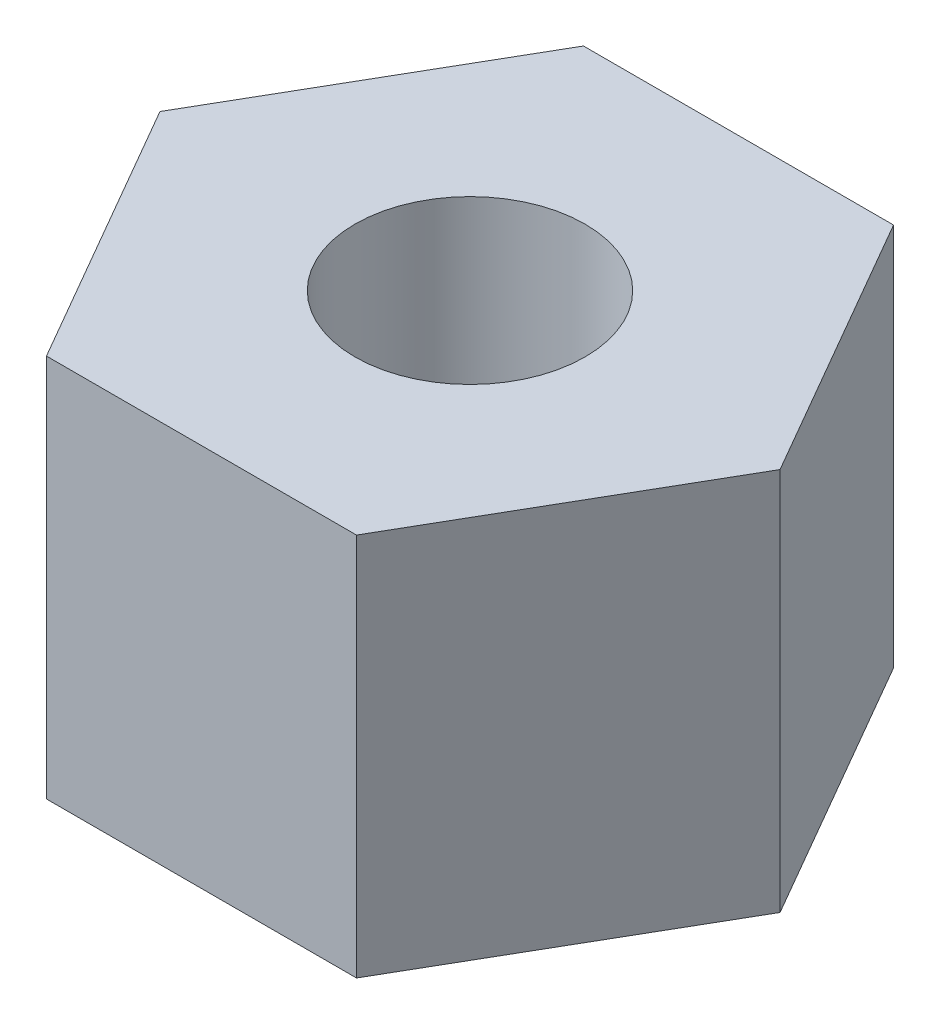
ISO-10303-21;
HEADER;
FILE_DESCRIPTION(('STEP AP214'),'2;1');
FILE_NAME('part.step','',(''),(''),'','','');
FILE_SCHEMA(('AUTOMOTIVE_DESIGN { 1 0 10303 214 1 1 1 1 }'));
ENDSEC;
DATA;
#1=APPLICATION_CONTEXT('core data for automotive mechanical design processes');
#2=APPLICATION_PROTOCOL_DEFINITION('international standard','automotive_design',2000,#1);
#3=PRODUCT_CONTEXT('',#1,'mechanical');
#4=PRODUCT('Part','Part','',(#3));
#5=PRODUCT_RELATED_PRODUCT_CATEGORY('part','',(#4));
#6=PRODUCT_DEFINITION_FORMATION('','',#4);
#7=PRODUCT_DEFINITION_CONTEXT('part definition',#1,'design');
#8=PRODUCT_DEFINITION('design','',#6,#7);
#9=PRODUCT_DEFINITION_SHAPE('','',#8);
#10=(LENGTH_UNIT() NAMED_UNIT(*) SI_UNIT(.MILLI.,.METRE.));
#11=(NAMED_UNIT(*) PLANE_ANGLE_UNIT() SI_UNIT($,.RADIAN.));
#12=(NAMED_UNIT(*) SI_UNIT($,.STERADIAN.) SOLID_ANGLE_UNIT());
#13=UNCERTAINTY_MEASURE_WITH_UNIT(LENGTH_MEASURE(1.E-05),#10,'distance_accuracy_value','');
#14=(GEOMETRIC_REPRESENTATION_CONTEXT(3) GLOBAL_UNCERTAINTY_ASSIGNED_CONTEXT((#13)) GLOBAL_UNIT_ASSIGNED_CONTEXT((#10,
#11,#12)) REPRESENTATION_CONTEXT('',''));
#15=CARTESIAN_POINT('',(0.,0.,0.));
#16=DIRECTION('',(0.,0.,1.));
#17=DIRECTION('',(1.,0.,0.));
#18=AXIS2_PLACEMENT_3D('',#15,#16,#17);
#19=CARTESIAN_POINT('',(0.,2.5,3.5));
#20=DIRECTION('',(0.,0.,-1.));
#21=DIRECTION('',(-1.,0.,0.));
#22=AXIS2_PLACEMENT_3D('',#19,#20,#21);
#23=PLANE('',#22);
#24=DIRECTION('',(1.,0.,0.));
#25=VECTOR('',#24,1.);
#26=CARTESIAN_POINT('',(0.,-2.5,3.5));
#27=LINE('',#26,#25);
#28=CARTESIAN_POINT('',(-2.02072594216369,-2.5,3.5));
#29=VERTEX_POINT('',#28);
#30=CARTESIAN_POINT('',(2.02072594216369,-2.5,3.5));
#31=VERTEX_POINT('',#30);
#32=EDGE_CURVE('E123',#29,#31,#27,.T.);
#33=ORIENTED_EDGE('',*,*,#32,.T.);
#34=DIRECTION('',(0.,-1.,0.));
#35=VECTOR('',#34,1.);
#36=CARTESIAN_POINT('',(2.02072594216369,2.5,3.5));
#37=LINE('',#36,#35);
#38=CARTESIAN_POINT('',(2.02072594216369,2.5,3.5));
#39=VERTEX_POINT('',#38);
#40=EDGE_CURVE('E11',#39,#31,#37,.T.);
#41=ORIENTED_EDGE('',*,*,#40,.F.);
#42=DIRECTION('',(1.,0.,0.));
#43=VECTOR('',#42,1.);
#44=CARTESIAN_POINT('',(0.,2.5,3.5));
#45=LINE('',#44,#43);
#46=CARTESIAN_POINT('',(-2.02072594216369,2.5,3.5));
#47=VERTEX_POINT('',#46);
#48=EDGE_CURVE('E146',#47,#39,#45,.T.);
#49=ORIENTED_EDGE('',*,*,#48,.F.);
#50=DIRECTION('',(0.,-1.,0.));
#51=VECTOR('',#50,1.);
#52=CARTESIAN_POINT('',(-2.02072594216369,2.5,3.5));
#53=LINE('',#52,#51);
#54=EDGE_CURVE('E116',#47,#29,#53,.T.);
#55=ORIENTED_EDGE('',*,*,#54,.T.);
#56=EDGE_LOOP('',(#33,#41,#49,#55));
#57=FACE_BOUND('',#56,.T.);
#58=ADVANCED_FACE('F35',(#57),#23,.F.);
#59=CARTESIAN_POINT('',(3.03108891324554,2.5,1.75));
#60=DIRECTION('',(-0.866025403784439,0.,-0.5));
#61=DIRECTION('',(-0.5,0.,0.866025403784439));
#62=AXIS2_PLACEMENT_3D('',#59,#60,#61);
#63=PLANE('',#62);
#64=DIRECTION('',(0.5,0.,-0.866025403784439));
#65=VECTOR('',#64,1.);
#66=CARTESIAN_POINT('',(3.03108891324554,-2.5,1.75));
#67=LINE('',#66,#65);
#68=CARTESIAN_POINT('',(4.04145188432738,-2.5,0.));
#69=VERTEX_POINT('',#68);
#70=EDGE_CURVE('E126',#31,#69,#67,.T.);
#71=ORIENTED_EDGE('',*,*,#70,.T.);
#72=DIRECTION('',(0.,-1.,0.));
#73=VECTOR('',#72,1.);
#74=CARTESIAN_POINT('',(4.04145188432738,2.5,0.));
#75=LINE('',#74,#73);
#76=CARTESIAN_POINT('',(4.04145188432738,2.5,0.));
#77=VERTEX_POINT('',#76);
#78=EDGE_CURVE('E44',#77,#69,#75,.T.);
#79=ORIENTED_EDGE('',*,*,#78,.F.);
#80=DIRECTION('',(0.5,0.,-0.866025403784439));
#81=VECTOR('',#80,1.);
#82=CARTESIAN_POINT('',(3.03108891324554,2.5,1.75));
#83=LINE('',#82,#81);
#84=EDGE_CURVE('E89',#39,#77,#83,.T.);
#85=ORIENTED_EDGE('',*,*,#84,.F.);
#86=ORIENTED_EDGE('',*,*,#40,.T.);
#87=EDGE_LOOP('',(#71,#79,#85,#86));
#88=FACE_BOUND('',#87,.T.);
#89=ADVANCED_FACE('F160',(#88),#63,.F.);
#90=CARTESIAN_POINT('',(3.03108891324554,2.5,-1.75));
#91=DIRECTION('',(-0.866025403784439,0.,0.5));
#92=DIRECTION('',(0.5,0.,0.866025403784439));
#93=AXIS2_PLACEMENT_3D('',#90,#91,#92);
#94=PLANE('',#93);
#95=DIRECTION('',(-0.5,0.,-0.866025403784439));
#96=VECTOR('',#95,1.);
#97=CARTESIAN_POINT('',(3.03108891324554,-2.5,-1.75));
#98=LINE('',#97,#96);
#99=CARTESIAN_POINT('',(2.02072594216369,-2.5,-3.5));
#100=VERTEX_POINT('',#99);
#101=EDGE_CURVE('E128',#69,#100,#98,.T.);
#102=ORIENTED_EDGE('',*,*,#101,.T.);
#103=DIRECTION('',(0.,-1.,0.));
#104=VECTOR('',#103,1.);
#105=CARTESIAN_POINT('',(2.02072594216369,2.5,-3.5));
#106=LINE('',#105,#104);
#107=CARTESIAN_POINT('',(2.02072594216369,2.5,-3.5));
#108=VERTEX_POINT('',#107);
#109=EDGE_CURVE('E111',#108,#100,#106,.T.);
#110=ORIENTED_EDGE('',*,*,#109,.F.);
#111=DIRECTION('',(-0.5,0.,-0.866025403784439));
#112=VECTOR('',#111,1.);
#113=CARTESIAN_POINT('',(3.03108891324554,2.5,-1.75));
#114=LINE('',#113,#112);
#115=EDGE_CURVE('E102',#77,#108,#114,.T.);
#116=ORIENTED_EDGE('',*,*,#115,.F.);
#117=ORIENTED_EDGE('',*,*,#78,.T.);
#118=EDGE_LOOP('',(#102,#110,#116,#117));
#119=FACE_BOUND('',#118,.T.);
#120=ADVANCED_FACE('F139',(#119),#94,.F.);
#121=CARTESIAN_POINT('',(0.,2.5,-3.5));
#122=DIRECTION('',(0.,0.,1.));
#123=DIRECTION('',(1.,0.,0.));
#124=AXIS2_PLACEMENT_3D('',#121,#122,#123);
#125=PLANE('',#124);
#126=DIRECTION('',(-1.,0.,0.));
#127=VECTOR('',#126,1.);
#128=CARTESIAN_POINT('',(0.,-2.5,-3.5));
#129=LINE('',#128,#127);
#130=CARTESIAN_POINT('',(-2.02072594216369,-2.5,-3.5));
#131=VERTEX_POINT('',#130);
#132=EDGE_CURVE('E110',#100,#131,#129,.T.);
#133=ORIENTED_EDGE('',*,*,#132,.T.);
#134=DIRECTION('',(0.,-1.,0.));
#135=VECTOR('',#134,1.);
#136=CARTESIAN_POINT('',(-2.02072594216369,2.5,-3.5));
#137=LINE('',#136,#135);
#138=CARTESIAN_POINT('',(-2.02072594216369,2.5,-3.5));
#139=VERTEX_POINT('',#138);
#140=EDGE_CURVE('E107',#139,#131,#137,.T.);
#141=ORIENTED_EDGE('',*,*,#140,.F.);
#142=DIRECTION('',(-1.,0.,0.));
#143=VECTOR('',#142,1.);
#144=CARTESIAN_POINT('',(0.,2.5,-3.5));
#145=LINE('',#144,#143);
#146=EDGE_CURVE('E96',#108,#139,#145,.T.);
#147=ORIENTED_EDGE('',*,*,#146,.F.);
#148=ORIENTED_EDGE('',*,*,#109,.T.);
#149=EDGE_LOOP('',(#133,#141,#147,#148));
#150=FACE_BOUND('',#149,.T.);
#151=ADVANCED_FACE('F108',(#150),#125,.F.);
#152=CARTESIAN_POINT('',(-3.03108891324554,2.5,-1.75));
#153=DIRECTION('',(0.866025403784439,0.,0.5));
#154=DIRECTION('',(0.5,0.,-0.866025403784439));
#155=AXIS2_PLACEMENT_3D('',#152,#153,#154);
#156=PLANE('',#155);
#157=DIRECTION('',(-0.5,0.,0.866025403784439));
#158=VECTOR('',#157,1.);
#159=CARTESIAN_POINT('',(-3.03108891324554,-2.5,-1.75));
#160=LINE('',#159,#158);
#161=CARTESIAN_POINT('',(-4.04145188432738,-2.5,0.));
#162=VERTEX_POINT('',#161);
#163=EDGE_CURVE('E75',#131,#162,#160,.T.);
#164=ORIENTED_EDGE('',*,*,#163,.T.);
#165=DIRECTION('',(0.,-1.,0.));
#166=VECTOR('',#165,1.);
#167=CARTESIAN_POINT('',(-4.04145188432738,2.5,0.));
#168=LINE('',#167,#166);
#169=CARTESIAN_POINT('',(-4.04145188432738,2.5,0.));
#170=VERTEX_POINT('',#169);
#171=EDGE_CURVE('E112',#170,#162,#168,.T.);
#172=ORIENTED_EDGE('',*,*,#171,.F.);
#173=DIRECTION('',(-0.5,0.,0.866025403784439));
#174=VECTOR('',#173,1.);
#175=CARTESIAN_POINT('',(-3.03108891324554,2.5,-1.75));
#176=LINE('',#175,#174);
#177=EDGE_CURVE('E100',#139,#170,#176,.T.);
#178=ORIENTED_EDGE('',*,*,#177,.F.);
#179=ORIENTED_EDGE('',*,*,#140,.T.);
#180=EDGE_LOOP('',(#164,#172,#178,#179));
#181=FACE_BOUND('',#180,.T.);
#182=ADVANCED_FACE('F114',(#181),#156,.F.);
#183=CARTESIAN_POINT('',(0.,2.5,0.));
#184=DIRECTION('',(0.,-1.,0.));
#185=DIRECTION('',(0.,0.,-1.));
#186=AXIS2_PLACEMENT_3D('',#183,#184,#185);
#187=CYLINDRICAL_SURFACE('',#186,1.5);
#188=CARTESIAN_POINT('',(0.,2.5,0.));
#189=DIRECTION('',(0.,1.,0.));
#190=DIRECTION('',(0.,0.,1.));
#191=AXIS2_PLACEMENT_3D('',#188,#189,#190);
#192=CIRCLE('',#191,1.5);
#193=CARTESIAN_POINT('',(0.,2.5,1.5));
#194=VERTEX_POINT('',#193);
#195=EDGE_CURVE('E133',#194,#194,#192,.T.);
#196=ORIENTED_EDGE('',*,*,#195,.T.);
#197=EDGE_LOOP('',(#196));
#198=FACE_BOUND('',#197,.T.);
#199=CARTESIAN_POINT('',(0.,-2.5,0.));
#200=DIRECTION('',(0.,1.,0.));
#201=DIRECTION('',(0.,0.,1.));
#202=AXIS2_PLACEMENT_3D('',#199,#200,#201);
#203=CIRCLE('',#202,1.5);
#204=CARTESIAN_POINT('',(0.,-2.5,1.5));
#205=VERTEX_POINT('',#204);
#206=EDGE_CURVE('E120',#205,#205,#203,.T.);
#207=ORIENTED_EDGE('',*,*,#206,.F.);
#208=EDGE_LOOP('',(#207));
#209=FACE_BOUND('',#208,.T.);
#210=ADVANCED_FACE('F37',(#198,#209),#187,.F.);
#211=CARTESIAN_POINT('',(-3.03108891324554,2.5,1.75));
#212=DIRECTION('',(0.866025403784439,0.,-0.5));
#213=DIRECTION('',(-0.5,0.,-0.866025403784439));
#214=AXIS2_PLACEMENT_3D('',#211,#212,#213);
#215=PLANE('',#214);
#216=DIRECTION('',(0.5,0.,0.866025403784439));
#217=VECTOR('',#216,1.);
#218=CARTESIAN_POINT('',(-3.03108891324554,-2.5,1.75));
#219=LINE('',#218,#217);
#220=EDGE_CURVE('E81',#162,#29,#219,.T.);
#221=ORIENTED_EDGE('',*,*,#220,.T.);
#222=ORIENTED_EDGE('',*,*,#54,.F.);
#223=DIRECTION('',(0.5,0.,0.866025403784439));
#224=VECTOR('',#223,1.);
#225=CARTESIAN_POINT('',(-3.03108891324554,2.5,1.75));
#226=LINE('',#225,#224);
#227=EDGE_CURVE('E52',#170,#47,#226,.T.);
#228=ORIENTED_EDGE('',*,*,#227,.F.);
#229=ORIENTED_EDGE('',*,*,#171,.T.);
#230=EDGE_LOOP('',(#221,#222,#228,#229));
#231=FACE_BOUND('',#230,.T.);
#232=ADVANCED_FACE('F147',(#231),#215,.F.);
#233=CARTESIAN_POINT('',(0.,2.5,0.));
#234=DIRECTION('',(0.,1.,0.));
#235=DIRECTION('',(0.,0.,1.));
#236=AXIS2_PLACEMENT_3D('',#233,#234,#235);
#237=PLANE('',#236);
#238=ORIENTED_EDGE('',*,*,#195,.F.);
#239=EDGE_LOOP('',(#238));
#240=FACE_BOUND('',#239,.T.);
#241=ORIENTED_EDGE('',*,*,#48,.T.);
#242=ORIENTED_EDGE('',*,*,#84,.T.);
#243=ORIENTED_EDGE('',*,*,#115,.T.);
#244=ORIENTED_EDGE('',*,*,#146,.T.);
#245=ORIENTED_EDGE('',*,*,#177,.T.);
#246=ORIENTED_EDGE('',*,*,#227,.T.);
#247=EDGE_LOOP('',(#241,#242,#243,#244,#245,#246));
#248=FACE_BOUND('',#247,.T.);
#249=ADVANCED_FACE('F98',(#240,#248),#237,.T.);
#250=CARTESIAN_POINT('',(0.,-2.5,0.));
#251=DIRECTION('',(0.,1.,0.));
#252=DIRECTION('',(0.,0.,1.));
#253=AXIS2_PLACEMENT_3D('',#250,#251,#252);
#254=PLANE('',#253);
#255=ORIENTED_EDGE('',*,*,#206,.T.);
#256=EDGE_LOOP('',(#255));
#257=FACE_BOUND('',#256,.T.);
#258=ORIENTED_EDGE('',*,*,#32,.F.);
#259=ORIENTED_EDGE('',*,*,#220,.F.);
#260=ORIENTED_EDGE('',*,*,#163,.F.);
#261=ORIENTED_EDGE('',*,*,#132,.F.);
#262=ORIENTED_EDGE('',*,*,#101,.F.);
#263=ORIENTED_EDGE('',*,*,#70,.F.);
#264=EDGE_LOOP('',(#258,#259,#260,#261,#262,#263));
#265=FACE_BOUND('',#264,.T.);
#266=ADVANCED_FACE('F142',(#257,#265),#254,.F.);
#267=CLOSED_SHELL('',(#58,#89,#120,#151,#182,#210,#232,#249,#266));
#268=MANIFOLD_SOLID_BREP('B2',#267);
#269=ADVANCED_BREP_SHAPE_REPRESENTATION('',(#18,#268),#14);
#270=SHAPE_DEFINITION_REPRESENTATION(#9,#269);
ENDSEC;
END-ISO-10303-21;
